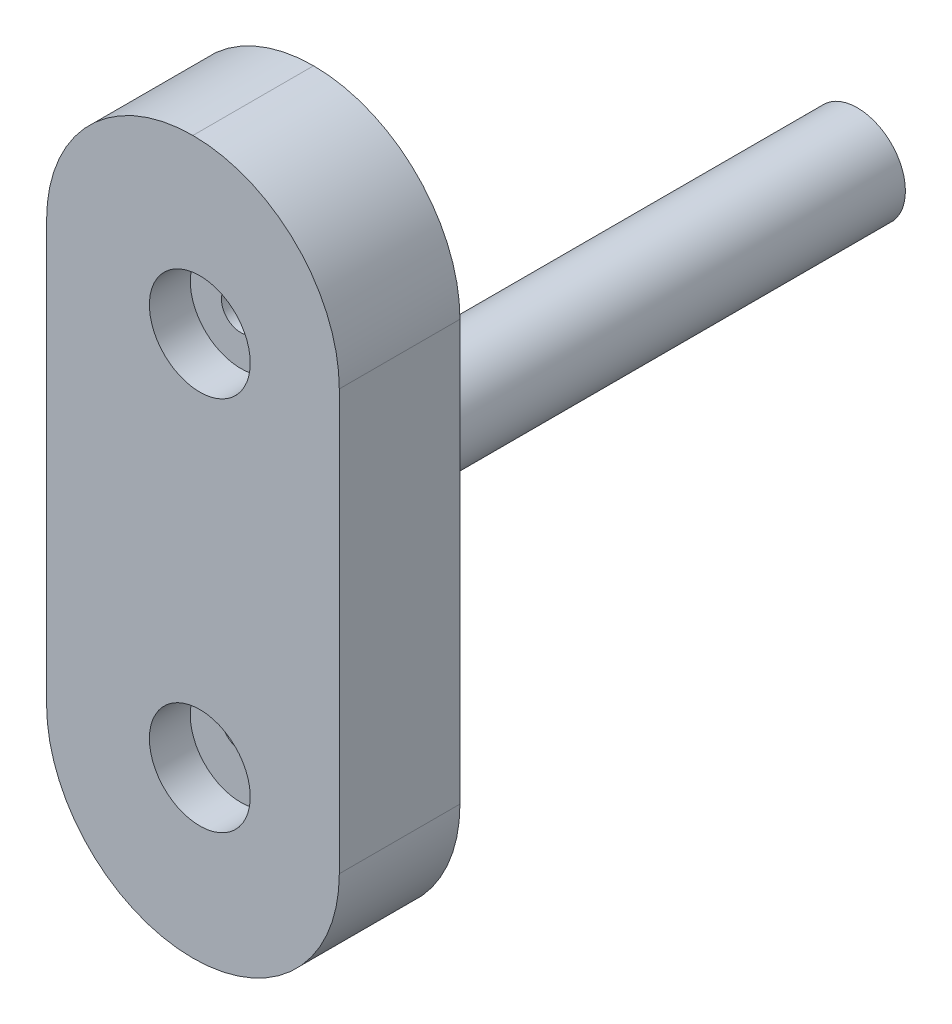
ISO-10303-21;
HEADER;
FILE_DESCRIPTION(('STEP AP214'),'2;1');
FILE_NAME('part.step','',(''),(''),'','','');
FILE_SCHEMA(('AUTOMOTIVE_DESIGN { 1 0 10303 214 1 1 1 1 }'));
ENDSEC;
DATA;
#1=APPLICATION_CONTEXT('core data for automotive mechanical design processes');
#2=APPLICATION_PROTOCOL_DEFINITION('international standard','automotive_design',2000,#1);
#3=PRODUCT_CONTEXT('',#1,'mechanical');
#4=PRODUCT('Part','Part','',(#3));
#5=PRODUCT_RELATED_PRODUCT_CATEGORY('part','',(#4));
#6=PRODUCT_DEFINITION_FORMATION('','',#4);
#7=PRODUCT_DEFINITION_CONTEXT('part definition',#1,'design');
#8=PRODUCT_DEFINITION('design','',#6,#7);
#9=PRODUCT_DEFINITION_SHAPE('','',#8);
#10=(LENGTH_UNIT() NAMED_UNIT(*) SI_UNIT(.MILLI.,.METRE.));
#11=(NAMED_UNIT(*) PLANE_ANGLE_UNIT() SI_UNIT($,.RADIAN.));
#12=(NAMED_UNIT(*) SI_UNIT($,.STERADIAN.) SOLID_ANGLE_UNIT());
#13=UNCERTAINTY_MEASURE_WITH_UNIT(LENGTH_MEASURE(1.E-05),#10,'distance_accuracy_value','');
#14=(GEOMETRIC_REPRESENTATION_CONTEXT(3) GLOBAL_UNCERTAINTY_ASSIGNED_CONTEXT((#13)) GLOBAL_UNIT_ASSIGNED_CONTEXT((#10,
#11,#12)) REPRESENTATION_CONTEXT('',''));
#15=CARTESIAN_POINT('',(0.,0.,0.));
#16=DIRECTION('',(0.,0.,1.));
#17=DIRECTION('',(1.,0.,0.));
#18=AXIS2_PLACEMENT_3D('',#15,#16,#17);
#19=CARTESIAN_POINT('',(0.,15.,54.5));
#20=DIRECTION('',(0.,0.,-1.));
#21=DIRECTION('',(-1.,0.,0.));
#22=AXIS2_PLACEMENT_3D('',#19,#20,#21);
#23=CYLINDRICAL_SURFACE('',#22,1.6);
#24=CARTESIAN_POINT('',(0.,15.,44.5));
#25=DIRECTION('',(0.,0.,-1.));
#26=DIRECTION('',(-1.,0.,0.));
#27=AXIS2_PLACEMENT_3D('',#24,#25,#26);
#28=CIRCLE('',#27,1.6);
#29=CARTESIAN_POINT('',(-1.6,15.,44.5));
#30=VERTEX_POINT('',#29);
#31=EDGE_CURVE('E116',#30,#30,#28,.T.);
#32=ORIENTED_EDGE('',*,*,#31,.T.);
#33=EDGE_LOOP('',(#32));
#34=FACE_BOUND('',#33,.T.);
#35=CARTESIAN_POINT('',(0.,15.,51.11));
#36=DIRECTION('',(0.,0.,1.));
#37=DIRECTION('',(1.,0.,0.));
#38=AXIS2_PLACEMENT_3D('',#35,#36,#37);
#39=CIRCLE('',#38,1.6);
#40=CARTESIAN_POINT('',(1.6,15.,51.11));
#41=VERTEX_POINT('',#40);
#42=EDGE_CURVE('E159',#41,#41,#39,.F.);
#43=ORIENTED_EDGE('',*,*,#42,.F.);
#44=EDGE_LOOP('',(#43));
#45=FACE_BOUND('',#44,.T.);
#46=ADVANCED_FACE('F41',(#34,#45),#23,.F.);
#47=CARTESIAN_POINT('',(0.,0.,54.5));
#48=DIRECTION('',(0.,0.,-1.));
#49=DIRECTION('',(-1.,0.,0.));
#50=AXIS2_PLACEMENT_3D('',#47,#48,#49);
#51=CYLINDRICAL_SURFACE('',#50,3.98);
#52=CARTESIAN_POINT('',(0.,0.,44.5));
#53=DIRECTION('',(0.,0.,-1.));
#54=DIRECTION('',(-1.,0.,0.));
#55=AXIS2_PLACEMENT_3D('',#52,#53,#54);
#56=CIRCLE('',#55,3.98);
#57=CARTESIAN_POINT('',(-3.98,0.,44.5));
#58=VERTEX_POINT('',#57);
#59=EDGE_CURVE('E147',#58,#58,#56,.T.);
#60=ORIENTED_EDGE('',*,*,#59,.T.);
#61=EDGE_LOOP('',(#60));
#62=FACE_BOUND('',#61,.T.);
#63=CARTESIAN_POINT('',(0.,0.,0.));
#64=DIRECTION('',(0.,0.,1.));
#65=DIRECTION('',(1.,0.,0.));
#66=AXIS2_PLACEMENT_3D('',#63,#64,#65);
#67=CIRCLE('',#66,3.98);
#68=CARTESIAN_POINT('',(3.98,0.,0.));
#69=VERTEX_POINT('',#68);
#70=EDGE_CURVE('E154',#69,#69,#67,.T.);
#71=ORIENTED_EDGE('',*,*,#70,.T.);
#72=EDGE_LOOP('',(#71));
#73=FACE_BOUND('',#72,.T.);
#74=ADVANCED_FACE('F186',(#62,#73),#51,.T.);
#75=CARTESIAN_POINT('',(0.,0.,0.));
#76=DIRECTION('',(0.,0.,1.));
#77=DIRECTION('',(1.,0.,0.));
#78=AXIS2_PLACEMENT_3D('',#75,#76,#77);
#79=PLANE('',#78);
#80=ORIENTED_EDGE('',*,*,#70,.F.);
#81=EDGE_LOOP('',(#80));
#82=FACE_BOUND('',#81,.T.);
#83=ADVANCED_FACE('F192',(#82),#79,.F.);
#84=CARTESIAN_POINT('',(11.56,-30.1,44.5));
#85=DIRECTION('',(1.,0.,0.));
#86=DIRECTION('',(0.,0.,-1.));
#87=AXIS2_PLACEMENT_3D('',#84,#85,#86);
#88=PLANE('',#87);
#89=DIRECTION('',(0.,1.,0.));
#90=VECTOR('',#89,1.);
#91=CARTESIAN_POINT('',(11.56,-30.1,54.5));
#92=LINE('',#91,#90);
#93=CARTESIAN_POINT('',(11.56,-17.97,54.5));
#94=VERTEX_POINT('',#93);
#95=CARTESIAN_POINT('',(11.56,16.83,54.5));
#96=VERTEX_POINT('',#95);
#97=EDGE_CURVE('E97',#94,#96,#92,.T.);
#98=ORIENTED_EDGE('',*,*,#97,.F.);
#99=DIRECTION('',(0.,0.,1.));
#100=VECTOR('',#99,1.);
#101=CARTESIAN_POINT('',(11.56,-17.97,44.5));
#102=LINE('',#101,#100);
#103=CARTESIAN_POINT('',(11.56,-17.97,44.5));
#104=VERTEX_POINT('',#103);
#105=EDGE_CURVE('E112',#94,#104,#102,.F.);
#106=ORIENTED_EDGE('',*,*,#105,.T.);
#107=DIRECTION('',(0.,1.,0.));
#108=VECTOR('',#107,1.);
#109=CARTESIAN_POINT('',(11.56,-30.1,44.5));
#110=LINE('',#109,#108);
#111=CARTESIAN_POINT('',(11.56,16.83,44.5));
#112=VERTEX_POINT('',#111);
#113=EDGE_CURVE('E144',#104,#112,#110,.T.);
#114=ORIENTED_EDGE('',*,*,#113,.T.);
#115=DIRECTION('',(0.,0.,1.));
#116=VECTOR('',#115,1.);
#117=CARTESIAN_POINT('',(11.56,16.83,44.5));
#118=LINE('',#117,#116);
#119=EDGE_CURVE('E106',#112,#96,#118,.T.);
#120=ORIENTED_EDGE('',*,*,#119,.T.);
#121=EDGE_LOOP('',(#98,#106,#114,#120));
#122=FACE_BOUND('',#121,.T.);
#123=ADVANCED_FACE('F110',(#122),#88,.T.);
#124=CARTESIAN_POINT('',(-12.7,-30.1,44.5));
#125=DIRECTION('',(-1.,0.,0.));
#126=DIRECTION('',(0.,0.,1.));
#127=AXIS2_PLACEMENT_3D('',#124,#125,#126);
#128=PLANE('',#127);
#129=DIRECTION('',(0.,-1.,0.));
#130=VECTOR('',#129,1.);
#131=CARTESIAN_POINT('',(-12.7,-30.1,44.5));
#132=LINE('',#131,#130);
#133=CARTESIAN_POINT('',(-12.7,16.83,44.5));
#134=VERTEX_POINT('',#133);
#135=CARTESIAN_POINT('',(-12.7,-17.97,44.5));
#136=VERTEX_POINT('',#135);
#137=EDGE_CURVE('E145',#134,#136,#132,.T.);
#138=ORIENTED_EDGE('',*,*,#137,.T.);
#139=DIRECTION('',(0.,0.,1.));
#140=VECTOR('',#139,1.);
#141=CARTESIAN_POINT('',(-12.7,-17.97,44.5));
#142=LINE('',#141,#140);
#143=CARTESIAN_POINT('',(-12.7,-17.97,54.5));
#144=VERTEX_POINT('',#143);
#145=EDGE_CURVE('E11',#136,#144,#142,.T.);
#146=ORIENTED_EDGE('',*,*,#145,.T.);
#147=DIRECTION('',(0.,-1.,0.));
#148=VECTOR('',#147,1.);
#149=CARTESIAN_POINT('',(-12.7,-30.1,54.5));
#150=LINE('',#149,#148);
#151=CARTESIAN_POINT('',(-12.7,16.83,54.5));
#152=VERTEX_POINT('',#151);
#153=EDGE_CURVE('E115',#152,#144,#150,.T.);
#154=ORIENTED_EDGE('',*,*,#153,.F.);
#155=DIRECTION('',(0.,0.,1.));
#156=VECTOR('',#155,1.);
#157=CARTESIAN_POINT('',(-12.7,16.83,44.5));
#158=LINE('',#157,#156);
#159=EDGE_CURVE('E50',#152,#134,#158,.F.);
#160=ORIENTED_EDGE('',*,*,#159,.T.);
#161=EDGE_LOOP('',(#138,#146,#154,#160));
#162=FACE_BOUND('',#161,.T.);
#163=ADVANCED_FACE('F170',(#162),#128,.T.);
#164=CARTESIAN_POINT('',(0.,0.,44.5));
#165=DIRECTION('',(0.,0.,-1.));
#166=DIRECTION('',(-1.,0.,0.));
#167=AXIS2_PLACEMENT_3D('',#164,#165,#166);
#168=PLANE('',#167);
#169=ORIENTED_EDGE('',*,*,#31,.F.);
#170=EDGE_LOOP('',(#169));
#171=FACE_BOUND('',#170,.T.);
#172=CARTESIAN_POINT('',(0.,-15.,44.5));
#173=DIRECTION('',(0.,0.,-1.));
#174=DIRECTION('',(1.,0.,0.));
#175=AXIS2_PLACEMENT_3D('',#172,#173,#174);
#176=CIRCLE('',#175,1.6);
#177=CARTESIAN_POINT('',(1.6,-15.,44.5));
#178=VERTEX_POINT('',#177);
#179=EDGE_CURVE('E151',#178,#178,#176,.T.);
#180=ORIENTED_EDGE('',*,*,#179,.F.);
#181=EDGE_LOOP('',(#180));
#182=FACE_BOUND('',#181,.T.);
#183=ORIENTED_EDGE('',*,*,#59,.F.);
#184=EDGE_LOOP('',(#183));
#185=FACE_BOUND('',#184,.T.);
#186=ORIENTED_EDGE('',*,*,#113,.F.);
#187=CARTESIAN_POINT('',(-0.569999999999998,-17.97,44.5));
#188=DIRECTION('',(0.,0.,-1.));
#189=DIRECTION('',(-1.,0.,0.));
#190=AXIS2_PLACEMENT_3D('',#187,#188,#189);
#191=CIRCLE('',#190,12.13);
#192=CARTESIAN_POINT('',(-0.570000000000001,-30.1,44.5));
#193=VERTEX_POINT('',#192);
#194=EDGE_CURVE('E119',#104,#193,#191,.T.);
#195=ORIENTED_EDGE('',*,*,#194,.T.);
#196=CARTESIAN_POINT('',(-0.569999999999998,-17.97,44.5));
#197=DIRECTION('',(0.,0.,-1.));
#198=DIRECTION('',(-1.,0.,0.));
#199=AXIS2_PLACEMENT_3D('',#196,#197,#198);
#200=CIRCLE('',#199,12.13);
#201=EDGE_CURVE('E64',#193,#136,#200,.T.);
#202=ORIENTED_EDGE('',*,*,#201,.T.);
#203=ORIENTED_EDGE('',*,*,#137,.F.);
#204=CARTESIAN_POINT('',(-0.569999999999998,16.83,44.5));
#205=DIRECTION('',(0.,0.,-1.));
#206=DIRECTION('',(-1.,0.,0.));
#207=AXIS2_PLACEMENT_3D('',#204,#205,#206);
#208=CIRCLE('',#207,12.13);
#209=CARTESIAN_POINT('',(-0.570000000000001,28.96,44.5));
#210=VERTEX_POINT('',#209);
#211=EDGE_CURVE('E58',#134,#210,#208,.T.);
#212=ORIENTED_EDGE('',*,*,#211,.T.);
#213=CARTESIAN_POINT('',(-0.569999999999998,16.83,44.5));
#214=DIRECTION('',(0.,0.,-1.));
#215=DIRECTION('',(-1.,0.,0.));
#216=AXIS2_PLACEMENT_3D('',#213,#214,#215);
#217=CIRCLE('',#216,12.13);
#218=EDGE_CURVE('E120',#210,#112,#217,.T.);
#219=ORIENTED_EDGE('',*,*,#218,.T.);
#220=EDGE_LOOP('',(#186,#195,#202,#203,#212,#219));
#221=FACE_BOUND('',#220,.T.);
#222=ADVANCED_FACE('F143',(#171,#182,#185,#221),#168,.T.);
#223=CARTESIAN_POINT('',(0.,0.,54.5));
#224=DIRECTION('',(0.,0.,1.));
#225=DIRECTION('',(1.,0.,0.));
#226=AXIS2_PLACEMENT_3D('',#223,#224,#225);
#227=PLANE('',#226);
#228=CARTESIAN_POINT('',(0.,15.,54.5));
#229=DIRECTION('',(0.,0.,1.));
#230=DIRECTION('',(1.,0.,0.));
#231=AXIS2_PLACEMENT_3D('',#228,#229,#230);
#232=CIRCLE('',#231,4.18);
#233=CARTESIAN_POINT('',(4.18,15.,54.5));
#234=VERTEX_POINT('',#233);
#235=EDGE_CURVE('E335',#234,#234,#232,.T.);
#236=ORIENTED_EDGE('',*,*,#235,.F.);
#237=EDGE_LOOP('',(#236));
#238=FACE_BOUND('',#237,.T.);
#239=CARTESIAN_POINT('',(0.,-16.14,54.5));
#240=DIRECTION('',(0.,0.,1.));
#241=DIRECTION('',(-1.,0.,0.));
#242=AXIS2_PLACEMENT_3D('',#239,#240,#241);
#243=CIRCLE('',#242,4.18);
#244=CARTESIAN_POINT('',(-4.18,-16.14,54.5));
#245=VERTEX_POINT('',#244);
#246=EDGE_CURVE('E130',#245,#245,#243,.T.);
#247=ORIENTED_EDGE('',*,*,#246,.F.);
#248=EDGE_LOOP('',(#247));
#249=FACE_BOUND('',#248,.T.);
#250=CARTESIAN_POINT('',(-0.569999999999998,-17.97,54.5));
#251=DIRECTION('',(0.,0.,1.));
#252=DIRECTION('',(1.,0.,0.));
#253=AXIS2_PLACEMENT_3D('',#250,#251,#252);
#254=CIRCLE('',#253,12.13);
#255=CARTESIAN_POINT('',(-0.570000000000001,-30.1,54.5));
#256=VERTEX_POINT('',#255);
#257=EDGE_CURVE('E101',#144,#256,#254,.T.);
#258=ORIENTED_EDGE('',*,*,#257,.T.);
#259=CARTESIAN_POINT('',(-0.569999999999998,-17.97,54.5));
#260=DIRECTION('',(0.,0.,1.));
#261=DIRECTION('',(1.,0.,0.));
#262=AXIS2_PLACEMENT_3D('',#259,#260,#261);
#263=CIRCLE('',#262,12.13);
#264=EDGE_CURVE('E94',#256,#94,#263,.T.);
#265=ORIENTED_EDGE('',*,*,#264,.T.);
#266=ORIENTED_EDGE('',*,*,#97,.T.);
#267=CARTESIAN_POINT('',(-0.569999999999998,16.83,54.5));
#268=DIRECTION('',(0.,0.,1.));
#269=DIRECTION('',(1.,0.,0.));
#270=AXIS2_PLACEMENT_3D('',#267,#268,#269);
#271=CIRCLE('',#270,12.13);
#272=CARTESIAN_POINT('',(-0.570000000000001,28.96,54.5));
#273=VERTEX_POINT('',#272);
#274=EDGE_CURVE('E142',#96,#273,#271,.T.);
#275=ORIENTED_EDGE('',*,*,#274,.T.);
#276=CARTESIAN_POINT('',(-0.569999999999998,16.83,54.5));
#277=DIRECTION('',(0.,0.,1.));
#278=DIRECTION('',(1.,0.,0.));
#279=AXIS2_PLACEMENT_3D('',#276,#277,#278);
#280=CIRCLE('',#279,12.13);
#281=EDGE_CURVE('E140',#273,#152,#280,.T.);
#282=ORIENTED_EDGE('',*,*,#281,.T.);
#283=ORIENTED_EDGE('',*,*,#153,.T.);
#284=EDGE_LOOP('',(#258,#265,#266,#275,#282,#283));
#285=FACE_BOUND('',#284,.T.);
#286=ADVANCED_FACE('F96',(#238,#249,#285),#227,.T.);
#287=CARTESIAN_POINT('',(0.,-15.,54.5));
#288=DIRECTION('',(0.,0.,-1.));
#289=DIRECTION('',(-1.,0.,0.));
#290=AXIS2_PLACEMENT_3D('',#287,#288,#289);
#291=CYLINDRICAL_SURFACE('',#290,1.6);
#292=CARTESIAN_POINT('',(0.,-15.,51.11));
#293=DIRECTION('',(0.,0.,-1.));
#294=DIRECTION('',(-1.,0.,0.));
#295=AXIS2_PLACEMENT_3D('',#292,#293,#294);
#296=CIRCLE('',#295,1.6);
#297=CARTESIAN_POINT('',(-1.6,-15.,51.11));
#298=VERTEX_POINT('',#297);
#299=EDGE_CURVE('E162',#298,#298,#296,.F.);
#300=ORIENTED_EDGE('',*,*,#299,.T.);
#301=EDGE_LOOP('',(#300));
#302=FACE_BOUND('',#301,.T.);
#303=ORIENTED_EDGE('',*,*,#179,.T.);
#304=EDGE_LOOP('',(#303));
#305=FACE_BOUND('',#304,.T.);
#306=ADVANCED_FACE('F199',(#302,#305),#291,.F.);
#307=CARTESIAN_POINT('',(0.,15.,51.11));
#308=DIRECTION('',(0.,0.,1.));
#309=DIRECTION('',(1.,0.,0.));
#310=AXIS2_PLACEMENT_3D('',#307,#308,#309);
#311=PLANE('',#310);
#312=CARTESIAN_POINT('',(0.,15.,51.11));
#313=DIRECTION('',(0.,0.,1.));
#314=DIRECTION('',(1.,0.,0.));
#315=AXIS2_PLACEMENT_3D('',#312,#313,#314);
#316=CIRCLE('',#315,4.18);
#317=CARTESIAN_POINT('',(4.18,15.,51.11));
#318=VERTEX_POINT('',#317);
#319=EDGE_CURVE('E163',#318,#318,#316,.T.);
#320=ORIENTED_EDGE('',*,*,#319,.T.);
#321=EDGE_LOOP('',(#320));
#322=FACE_BOUND('',#321,.T.);
#323=ORIENTED_EDGE('',*,*,#42,.T.);
#324=EDGE_LOOP('',(#323));
#325=FACE_BOUND('',#324,.T.);
#326=ADVANCED_FACE('F202',(#322,#325),#311,.T.);
#327=CARTESIAN_POINT('',(0.,15.,51.11));
#328=DIRECTION('',(0.,0.,1.));
#329=DIRECTION('',(1.,0.,0.));
#330=AXIS2_PLACEMENT_3D('',#327,#328,#329);
#331=CYLINDRICAL_SURFACE('',#330,4.18);
#332=ORIENTED_EDGE('',*,*,#319,.F.);
#333=EDGE_LOOP('',(#332));
#334=FACE_BOUND('',#333,.T.);
#335=ORIENTED_EDGE('',*,*,#235,.T.);
#336=EDGE_LOOP('',(#335));
#337=FACE_BOUND('',#336,.T.);
#338=ADVANCED_FACE('F249',(#334,#337),#331,.F.);
#339=CARTESIAN_POINT('',(0.,-16.14,51.11));
#340=DIRECTION('',(0.,0.,-1.));
#341=DIRECTION('',(-1.,0.,0.));
#342=AXIS2_PLACEMENT_3D('',#339,#340,#341);
#343=PLANE('',#342);
#344=CARTESIAN_POINT('',(0.,-16.14,51.11));
#345=DIRECTION('',(0.,0.,1.));
#346=DIRECTION('',(-1.,0.,0.));
#347=AXIS2_PLACEMENT_3D('',#344,#345,#346);
#348=CIRCLE('',#347,4.18);
#349=CARTESIAN_POINT('',(-4.18,-16.14,51.11));
#350=VERTEX_POINT('',#349);
#351=EDGE_CURVE('E132',#350,#350,#348,.T.);
#352=ORIENTED_EDGE('',*,*,#351,.T.);
#353=EDGE_LOOP('',(#352));
#354=FACE_BOUND('',#353,.T.);
#355=ORIENTED_EDGE('',*,*,#299,.F.);
#356=EDGE_LOOP('',(#355));
#357=FACE_BOUND('',#356,.T.);
#358=ADVANCED_FACE('F182',(#354,#357),#343,.F.);
#359=CARTESIAN_POINT('',(0.,-16.14,51.11));
#360=DIRECTION('',(0.,0.,1.));
#361=DIRECTION('',(1.,0.,0.));
#362=AXIS2_PLACEMENT_3D('',#359,#360,#361);
#363=CYLINDRICAL_SURFACE('',#362,4.18);
#364=ORIENTED_EDGE('',*,*,#351,.F.);
#365=EDGE_LOOP('',(#364));
#366=FACE_BOUND('',#365,.T.);
#367=ORIENTED_EDGE('',*,*,#246,.T.);
#368=EDGE_LOOP('',(#367));
#369=FACE_BOUND('',#368,.T.);
#370=ADVANCED_FACE('F175',(#366,#369),#363,.F.);
#371=CARTESIAN_POINT('',(-0.569999999999998,-17.97,44.5));
#372=DIRECTION('',(0.,0.,1.));
#373=DIRECTION('',(1.,0.,0.));
#374=AXIS2_PLACEMENT_3D('',#371,#372,#373);
#375=CYLINDRICAL_SURFACE('',#374,12.13);
#376=ORIENTED_EDGE('',*,*,#145,.F.);
#377=ORIENTED_EDGE('',*,*,#201,.F.);
#378=DIRECTION('',(0.,0.,1.));
#379=VECTOR('',#378,1.);
#380=CARTESIAN_POINT('',(-0.569999999999998,-30.1,44.5));
#381=LINE('',#380,#379);
#382=EDGE_CURVE('E129',#256,#193,#381,.F.);
#383=ORIENTED_EDGE('',*,*,#382,.F.);
#384=ORIENTED_EDGE('',*,*,#257,.F.);
#385=EDGE_LOOP('',(#376,#377,#383,#384));
#386=FACE_BOUND('',#385,.T.);
#387=ADVANCED_FACE('F173',(#386),#375,.T.);
#388=CARTESIAN_POINT('',(-0.569999999999998,-17.97,44.5));
#389=DIRECTION('',(0.,0.,1.));
#390=DIRECTION('',(1.,0.,0.));
#391=AXIS2_PLACEMENT_3D('',#388,#389,#390);
#392=CYLINDRICAL_SURFACE('',#391,12.13);
#393=ORIENTED_EDGE('',*,*,#194,.F.);
#394=ORIENTED_EDGE('',*,*,#105,.F.);
#395=ORIENTED_EDGE('',*,*,#264,.F.);
#396=ORIENTED_EDGE('',*,*,#382,.T.);
#397=EDGE_LOOP('',(#393,#394,#395,#396));
#398=FACE_BOUND('',#397,.T.);
#399=ADVANCED_FACE('F118',(#398),#392,.T.);
#400=CARTESIAN_POINT('',(-0.569999999999998,16.83,44.5));
#401=DIRECTION('',(0.,0.,1.));
#402=DIRECTION('',(1.,0.,0.));
#403=AXIS2_PLACEMENT_3D('',#400,#401,#402);
#404=CYLINDRICAL_SURFACE('',#403,12.13);
#405=ORIENTED_EDGE('',*,*,#119,.F.);
#406=ORIENTED_EDGE('',*,*,#218,.F.);
#407=DIRECTION('',(0.,0.,1.));
#408=VECTOR('',#407,1.);
#409=CARTESIAN_POINT('',(-0.569999999999998,28.96,44.5));
#410=LINE('',#409,#408);
#411=EDGE_CURVE('E45',#273,#210,#410,.F.);
#412=ORIENTED_EDGE('',*,*,#411,.F.);
#413=ORIENTED_EDGE('',*,*,#274,.F.);
#414=EDGE_LOOP('',(#405,#406,#412,#413));
#415=FACE_BOUND('',#414,.T.);
#416=ADVANCED_FACE('F43',(#415),#404,.T.);
#417=CARTESIAN_POINT('',(-0.569999999999998,16.83,44.5));
#418=DIRECTION('',(0.,0.,1.));
#419=DIRECTION('',(1.,0.,0.));
#420=AXIS2_PLACEMENT_3D('',#417,#418,#419);
#421=CYLINDRICAL_SURFACE('',#420,12.13);
#422=ORIENTED_EDGE('',*,*,#211,.F.);
#423=ORIENTED_EDGE('',*,*,#159,.F.);
#424=ORIENTED_EDGE('',*,*,#281,.F.);
#425=ORIENTED_EDGE('',*,*,#411,.T.);
#426=EDGE_LOOP('',(#422,#423,#424,#425));
#427=FACE_BOUND('',#426,.T.);
#428=ADVANCED_FACE('F138',(#427),#421,.T.);
#429=CLOSED_SHELL('',(#46,#74,#83,#123,#163,#222,#286,#306,#326,#338,#358,#370,#387,#399,#416,#428));
#430=MANIFOLD_SOLID_BREP('B2',#429);
#431=ADVANCED_BREP_SHAPE_REPRESENTATION('',(#18,#430),#14);
#432=SHAPE_DEFINITION_REPRESENTATION(#9,#431);
ENDSEC;
END-ISO-10303-21;
